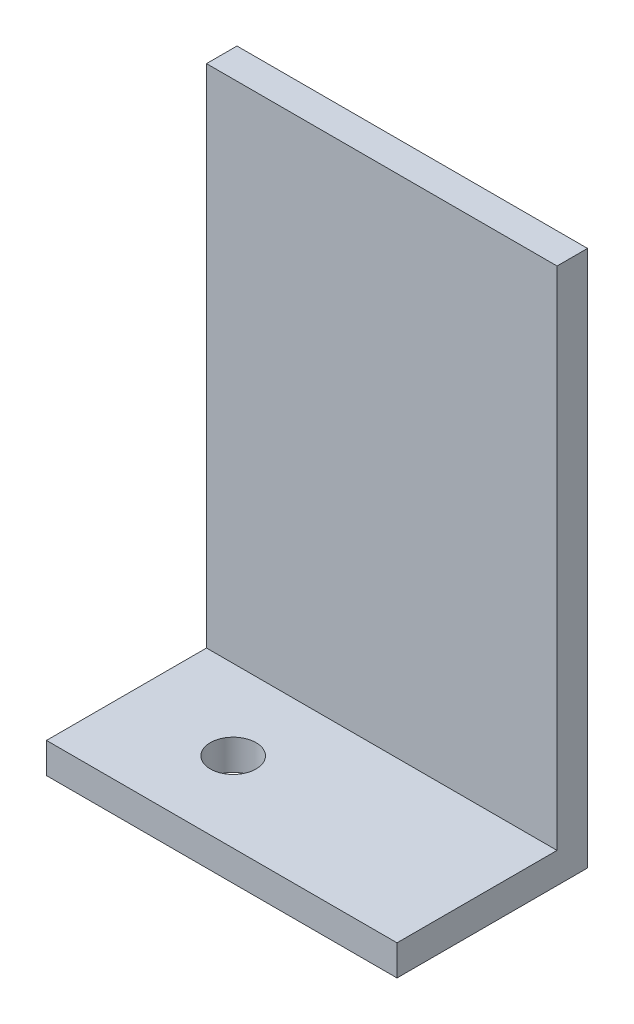
ISO-10303-21;
HEADER;
FILE_DESCRIPTION(('STEP AP214'),'2;1');
FILE_NAME('part.step','',(''),(''),'','','');
FILE_SCHEMA(('AUTOMOTIVE_DESIGN { 1 0 10303 214 1 1 1 1 }'));
ENDSEC;
DATA;
#1=APPLICATION_CONTEXT('core data for automotive mechanical design processes');
#2=APPLICATION_PROTOCOL_DEFINITION('international standard','automotive_design',2000,#1);
#3=PRODUCT_CONTEXT('',#1,'mechanical');
#4=PRODUCT('Part','Part','',(#3));
#5=PRODUCT_RELATED_PRODUCT_CATEGORY('part','',(#4));
#6=PRODUCT_DEFINITION_FORMATION('','',#4);
#7=PRODUCT_DEFINITION_CONTEXT('part definition',#1,'design');
#8=PRODUCT_DEFINITION('design','',#6,#7);
#9=PRODUCT_DEFINITION_SHAPE('','',#8);
#10=(LENGTH_UNIT() NAMED_UNIT(*) SI_UNIT(.MILLI.,.METRE.));
#11=(NAMED_UNIT(*) PLANE_ANGLE_UNIT() SI_UNIT($,.RADIAN.));
#12=(NAMED_UNIT(*) SI_UNIT($,.STERADIAN.) SOLID_ANGLE_UNIT());
#13=UNCERTAINTY_MEASURE_WITH_UNIT(LENGTH_MEASURE(1.E-05),#10,'distance_accuracy_value','');
#14=(GEOMETRIC_REPRESENTATION_CONTEXT(3) GLOBAL_UNCERTAINTY_ASSIGNED_CONTEXT((#13)) GLOBAL_UNIT_ASSIGNED_CONTEXT((#10,
#11,#12)) REPRESENTATION_CONTEXT('',''));
#15=CARTESIAN_POINT('',(0.,0.,0.));
#16=DIRECTION('',(0.,0.,1.));
#17=DIRECTION('',(1.,0.,0.));
#18=AXIS2_PLACEMENT_3D('',#15,#16,#17);
#19=CARTESIAN_POINT('',(0.,2.,0.));
#20=DIRECTION('',(1.,0.,0.));
#21=DIRECTION('',(0.,0.,-1.));
#22=AXIS2_PLACEMENT_3D('',#19,#20,#21);
#23=PLANE('',#22);
#24=DIRECTION('',(0.,0.,1.));
#25=VECTOR('',#24,1.);
#26=CARTESIAN_POINT('',(0.,0.,0.));
#27=LINE('',#26,#25);
#28=CARTESIAN_POINT('',(0.,0.,-12.5));
#29=VERTEX_POINT('',#28);
#30=CARTESIAN_POINT('',(0.,0.,0.));
#31=VERTEX_POINT('',#30);
#32=EDGE_CURVE('E107',#29,#31,#27,.T.);
#33=ORIENTED_EDGE('',*,*,#32,.T.);
#34=DIRECTION('',(0.,-1.,0.));
#35=VECTOR('',#34,1.);
#36=CARTESIAN_POINT('',(0.,2.,0.));
#37=LINE('',#36,#35);
#38=CARTESIAN_POINT('',(0.,2.,0.));
#39=VERTEX_POINT('',#38);
#40=EDGE_CURVE('E11',#39,#31,#37,.T.);
#41=ORIENTED_EDGE('',*,*,#40,.F.);
#42=DIRECTION('',(0.,0.,1.));
#43=VECTOR('',#42,1.);
#44=CARTESIAN_POINT('',(0.,2.,0.));
#45=LINE('',#44,#43);
#46=CARTESIAN_POINT('',(0.,2.,-10.5));
#47=VERTEX_POINT('',#46);
#48=EDGE_CURVE('E101',#47,#39,#45,.T.);
#49=ORIENTED_EDGE('',*,*,#48,.F.);
#50=DIRECTION('',(0.,1.,0.));
#51=VECTOR('',#50,1.);
#52=CARTESIAN_POINT('',(0.,2.,-10.5));
#53=LINE('',#52,#51);
#54=CARTESIAN_POINT('',(0.,35.2062302978311,-10.5));
#55=VERTEX_POINT('',#54);
#56=EDGE_CURVE('E59',#47,#55,#53,.T.);
#57=ORIENTED_EDGE('',*,*,#56,.T.);
#58=DIRECTION('',(0.,0.,-1.));
#59=VECTOR('',#58,1.);
#60=CARTESIAN_POINT('',(0.,35.2062302978311,-10.5));
#61=LINE('',#60,#59);
#62=CARTESIAN_POINT('',(0.,35.2062302978311,-12.5));
#63=VERTEX_POINT('',#62);
#64=EDGE_CURVE('E109',#55,#63,#61,.T.);
#65=ORIENTED_EDGE('',*,*,#64,.T.);
#66=DIRECTION('',(0.,-1.,0.));
#67=VECTOR('',#66,1.);
#68=CARTESIAN_POINT('',(0.,2.,-12.5));
#69=LINE('',#68,#67);
#70=EDGE_CURVE('E93',#63,#29,#69,.T.);
#71=ORIENTED_EDGE('',*,*,#70,.T.);
#72=EDGE_LOOP('',(#33,#41,#49,#57,#65,#71));
#73=FACE_BOUND('',#72,.T.);
#74=ADVANCED_FACE('F44',(#73),#23,.F.);
#75=CARTESIAN_POINT('',(0.,2.,0.));
#76=DIRECTION('',(0.,0.,-1.));
#77=DIRECTION('',(-1.,0.,0.));
#78=AXIS2_PLACEMENT_3D('',#75,#76,#77);
#79=PLANE('',#78);
#80=DIRECTION('',(1.,0.,0.));
#81=VECTOR('',#80,1.);
#82=CARTESIAN_POINT('',(0.,0.,0.));
#83=LINE('',#82,#81);
#84=CARTESIAN_POINT('',(23.,0.,0.));
#85=VERTEX_POINT('',#84);
#86=EDGE_CURVE('E115',#31,#85,#83,.T.);
#87=ORIENTED_EDGE('',*,*,#86,.T.);
#88=DIRECTION('',(0.,-1.,0.));
#89=VECTOR('',#88,1.);
#90=CARTESIAN_POINT('',(23.,2.,0.));
#91=LINE('',#90,#89);
#92=CARTESIAN_POINT('',(23.,2.,0.));
#93=VERTEX_POINT('',#92);
#94=EDGE_CURVE('E52',#93,#85,#91,.T.);
#95=ORIENTED_EDGE('',*,*,#94,.F.);
#96=DIRECTION('',(1.,0.,0.));
#97=VECTOR('',#96,1.);
#98=CARTESIAN_POINT('',(0.,2.,0.));
#99=LINE('',#98,#97);
#100=EDGE_CURVE('E68',#39,#93,#99,.T.);
#101=ORIENTED_EDGE('',*,*,#100,.F.);
#102=ORIENTED_EDGE('',*,*,#40,.T.);
#103=EDGE_LOOP('',(#87,#95,#101,#102));
#104=FACE_BOUND('',#103,.T.);
#105=ADVANCED_FACE('F137',(#104),#79,.F.);
#106=CARTESIAN_POINT('',(23.,2.,0.));
#107=DIRECTION('',(-1.,0.,0.));
#108=DIRECTION('',(0.,0.,1.));
#109=AXIS2_PLACEMENT_3D('',#106,#107,#108);
#110=PLANE('',#109);
#111=DIRECTION('',(0.,0.,-1.));
#112=VECTOR('',#111,1.);
#113=CARTESIAN_POINT('',(23.,0.,0.));
#114=LINE('',#113,#112);
#115=CARTESIAN_POINT('',(23.,0.,-12.5));
#116=VERTEX_POINT('',#115);
#117=EDGE_CURVE('E102',#85,#116,#114,.T.);
#118=ORIENTED_EDGE('',*,*,#117,.T.);
#119=DIRECTION('',(0.,-1.,0.));
#120=VECTOR('',#119,1.);
#121=CARTESIAN_POINT('',(23.,2.,-12.5));
#122=LINE('',#121,#120);
#123=CARTESIAN_POINT('',(23.,35.2062302978311,-12.5));
#124=VERTEX_POINT('',#123);
#125=EDGE_CURVE('E96',#124,#116,#122,.T.);
#126=ORIENTED_EDGE('',*,*,#125,.F.);
#127=DIRECTION('',(0.,0.,-1.));
#128=VECTOR('',#127,1.);
#129=CARTESIAN_POINT('',(23.,35.2062302978311,-10.5));
#130=LINE('',#129,#128);
#131=CARTESIAN_POINT('',(23.,35.2062302978311,-10.5));
#132=VERTEX_POINT('',#131);
#133=EDGE_CURVE('E117',#132,#124,#130,.T.);
#134=ORIENTED_EDGE('',*,*,#133,.F.);
#135=DIRECTION('',(0.,-1.,0.));
#136=VECTOR('',#135,1.);
#137=CARTESIAN_POINT('',(23.,2.,-10.5));
#138=LINE('',#137,#136);
#139=CARTESIAN_POINT('',(23.,2.,-10.5));
#140=VERTEX_POINT('',#139);
#141=EDGE_CURVE('E150',#132,#140,#138,.T.);
#142=ORIENTED_EDGE('',*,*,#141,.T.);
#143=DIRECTION('',(0.,0.,-1.));
#144=VECTOR('',#143,1.);
#145=CARTESIAN_POINT('',(23.,2.,0.));
#146=LINE('',#145,#144);
#147=EDGE_CURVE('E112',#93,#140,#146,.T.);
#148=ORIENTED_EDGE('',*,*,#147,.F.);
#149=ORIENTED_EDGE('',*,*,#94,.T.);
#150=EDGE_LOOP('',(#118,#126,#134,#142,#148,#149));
#151=FACE_BOUND('',#150,.T.);
#152=ADVANCED_FACE('F134',(#151),#110,.F.);
#153=CARTESIAN_POINT('',(0.,2.,-12.5));
#154=DIRECTION('',(0.,0.,1.));
#155=DIRECTION('',(1.,0.,0.));
#156=AXIS2_PLACEMENT_3D('',#153,#154,#155);
#157=PLANE('',#156);
#158=DIRECTION('',(-1.,0.,0.));
#159=VECTOR('',#158,1.);
#160=CARTESIAN_POINT('',(0.,0.,-12.5));
#161=LINE('',#160,#159);
#162=EDGE_CURVE('E88',#116,#29,#161,.T.);
#163=ORIENTED_EDGE('',*,*,#162,.T.);
#164=ORIENTED_EDGE('',*,*,#70,.F.);
#165=DIRECTION('',(1.,0.,0.));
#166=VECTOR('',#165,1.);
#167=CARTESIAN_POINT('',(23.,35.2062302978311,-12.5));
#168=LINE('',#167,#166);
#169=EDGE_CURVE('E147',#63,#124,#168,.T.);
#170=ORIENTED_EDGE('',*,*,#169,.T.);
#171=ORIENTED_EDGE('',*,*,#125,.T.);
#172=EDGE_LOOP('',(#163,#164,#170,#171));
#173=FACE_BOUND('',#172,.T.);
#174=ADVANCED_FACE('F90',(#173),#157,.F.);
#175=CARTESIAN_POINT('',(0.,2.,0.));
#176=DIRECTION('',(0.,-1.,0.));
#177=DIRECTION('',(0.,0.,-1.));
#178=AXIS2_PLACEMENT_3D('',#175,#176,#177);
#179=PLANE('',#178);
#180=CARTESIAN_POINT('',(7.,2.,-5.25));
#181=DIRECTION('',(0.,1.,0.));
#182=DIRECTION('',(0.,0.,1.));
#183=AXIS2_PLACEMENT_3D('',#180,#181,#182);
#184=CIRCLE('',#183,1.5);
#185=CARTESIAN_POINT('',(7.,2.,-3.75));
#186=VERTEX_POINT('',#185);
#187=EDGE_CURVE('E162',#186,#186,#184,.T.);
#188=ORIENTED_EDGE('',*,*,#187,.F.);
#189=EDGE_LOOP('',(#188));
#190=FACE_BOUND('',#189,.T.);
#191=ORIENTED_EDGE('',*,*,#147,.T.);
#192=DIRECTION('',(-1.,0.,0.));
#193=VECTOR('',#192,1.);
#194=CARTESIAN_POINT('',(23.,2.,-10.5));
#195=LINE('',#194,#193);
#196=EDGE_CURVE('E157',#140,#47,#195,.T.);
#197=ORIENTED_EDGE('',*,*,#196,.T.);
#198=ORIENTED_EDGE('',*,*,#48,.T.);
#199=ORIENTED_EDGE('',*,*,#100,.T.);
#200=EDGE_LOOP('',(#191,#197,#198,#199));
#201=FACE_BOUND('',#200,.T.);
#202=ADVANCED_FACE('F178',(#190,#201),#179,.F.);
#203=CARTESIAN_POINT('',(0.,0.,0.));
#204=DIRECTION('',(0.,-1.,0.));
#205=DIRECTION('',(0.,0.,-1.));
#206=AXIS2_PLACEMENT_3D('',#203,#204,#205);
#207=PLANE('',#206);
#208=CARTESIAN_POINT('',(7.,0.,-5.25));
#209=DIRECTION('',(0.,1.,0.));
#210=DIRECTION('',(0.,0.,1.));
#211=AXIS2_PLACEMENT_3D('',#208,#209,#210);
#212=CIRCLE('',#211,1.5);
#213=CARTESIAN_POINT('',(7.,0.,-3.75));
#214=VERTEX_POINT('',#213);
#215=EDGE_CURVE('E151',#214,#214,#212,.T.);
#216=ORIENTED_EDGE('',*,*,#215,.T.);
#217=EDGE_LOOP('',(#216));
#218=FACE_BOUND('',#217,.T.);
#219=ORIENTED_EDGE('',*,*,#32,.F.);
#220=ORIENTED_EDGE('',*,*,#162,.F.);
#221=ORIENTED_EDGE('',*,*,#117,.F.);
#222=ORIENTED_EDGE('',*,*,#86,.F.);
#223=EDGE_LOOP('',(#219,#220,#221,#222));
#224=FACE_BOUND('',#223,.T.);
#225=ADVANCED_FACE('F114',(#218,#224),#207,.T.);
#226=CARTESIAN_POINT('',(23.,35.2062302978311,-10.5));
#227=DIRECTION('',(0.,1.,0.));
#228=DIRECTION('',(0.,0.,1.));
#229=AXIS2_PLACEMENT_3D('',#226,#227,#228);
#230=PLANE('',#229);
#231=ORIENTED_EDGE('',*,*,#169,.F.);
#232=ORIENTED_EDGE('',*,*,#64,.F.);
#233=DIRECTION('',(1.,0.,0.));
#234=VECTOR('',#233,1.);
#235=CARTESIAN_POINT('',(23.,35.2062302978311,-10.5));
#236=LINE('',#235,#234);
#237=EDGE_CURVE('E145',#55,#132,#236,.T.);
#238=ORIENTED_EDGE('',*,*,#237,.T.);
#239=ORIENTED_EDGE('',*,*,#133,.T.);
#240=EDGE_LOOP('',(#231,#232,#238,#239));
#241=FACE_BOUND('',#240,.T.);
#242=ADVANCED_FACE('F191',(#241),#230,.T.);
#243=CARTESIAN_POINT('',(0.,0.,-10.5));
#244=DIRECTION('',(0.,0.,1.));
#245=DIRECTION('',(1.,0.,0.));
#246=AXIS2_PLACEMENT_3D('',#243,#244,#245);
#247=PLANE('',#246);
#248=ORIENTED_EDGE('',*,*,#141,.F.);
#249=ORIENTED_EDGE('',*,*,#237,.F.);
#250=ORIENTED_EDGE('',*,*,#56,.F.);
#251=ORIENTED_EDGE('',*,*,#196,.F.);
#252=EDGE_LOOP('',(#248,#249,#250,#251));
#253=FACE_BOUND('',#252,.T.);
#254=ADVANCED_FACE('F174',(#253),#247,.T.);
#255=CARTESIAN_POINT('',(7.,0.,-5.25));
#256=DIRECTION('',(0.,1.,0.));
#257=DIRECTION('',(0.,0.,1.));
#258=AXIS2_PLACEMENT_3D('',#255,#256,#257);
#259=CYLINDRICAL_SURFACE('',#258,1.5);
#260=ORIENTED_EDGE('',*,*,#215,.F.);
#261=EDGE_LOOP('',(#260));
#262=FACE_BOUND('',#261,.T.);
#263=ORIENTED_EDGE('',*,*,#187,.T.);
#264=EDGE_LOOP('',(#263));
#265=FACE_BOUND('',#264,.T.);
#266=ADVANCED_FACE('F171',(#262,#265),#259,.F.);
#267=CLOSED_SHELL('',(#74,#105,#152,#174,#202,#225,#242,#254,#266));
#268=MANIFOLD_SOLID_BREP('B2',#267);
#269=ADVANCED_BREP_SHAPE_REPRESENTATION('',(#18,#268),#14);
#270=SHAPE_DEFINITION_REPRESENTATION(#9,#269);
ENDSEC;
END-ISO-10303-21;
